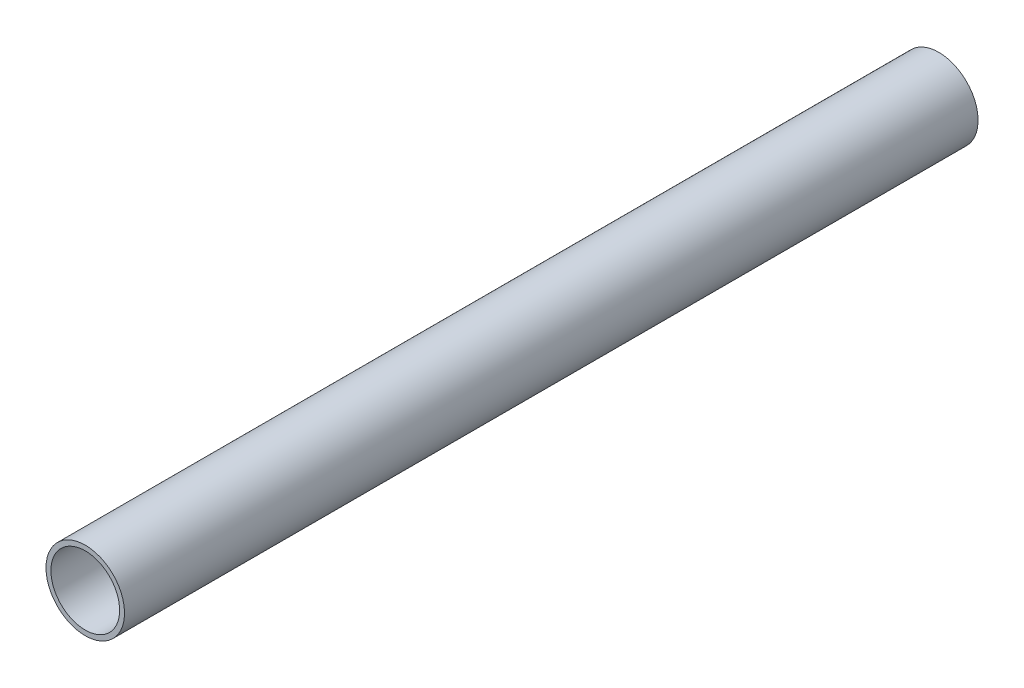
ISO-10303-21;
HEADER;
FILE_DESCRIPTION(('STEP AP214'),'2;1');
FILE_NAME('part.step','',(''),(''),'','','');
FILE_SCHEMA(('AUTOMOTIVE_DESIGN { 1 0 10303 214 1 1 1 1 }'));
ENDSEC;
DATA;
#1=APPLICATION_CONTEXT('core data for automotive mechanical design processes');
#2=APPLICATION_PROTOCOL_DEFINITION('international standard','automotive_design',2000,#1);
#3=PRODUCT_CONTEXT('',#1,'mechanical');
#4=PRODUCT('Part','Part','',(#3));
#5=PRODUCT_RELATED_PRODUCT_CATEGORY('part','',(#4));
#6=PRODUCT_DEFINITION_FORMATION('','',#4);
#7=PRODUCT_DEFINITION_CONTEXT('part definition',#1,'design');
#8=PRODUCT_DEFINITION('design','',#6,#7);
#9=PRODUCT_DEFINITION_SHAPE('','',#8);
#10=(LENGTH_UNIT() NAMED_UNIT(*) SI_UNIT(.MILLI.,.METRE.));
#11=(NAMED_UNIT(*) PLANE_ANGLE_UNIT() SI_UNIT($,.RADIAN.));
#12=(NAMED_UNIT(*) SI_UNIT($,.STERADIAN.) SOLID_ANGLE_UNIT());
#13=UNCERTAINTY_MEASURE_WITH_UNIT(LENGTH_MEASURE(1.E-05),#10,'distance_accuracy_value','');
#14=(GEOMETRIC_REPRESENTATION_CONTEXT(3) GLOBAL_UNCERTAINTY_ASSIGNED_CONTEXT((#13)) GLOBAL_UNIT_ASSIGNED_CONTEXT((#10,
#11,#12)) REPRESENTATION_CONTEXT('',''));
#15=CARTESIAN_POINT('',(0.,0.,0.));
#16=DIRECTION('',(0.,0.,1.));
#17=DIRECTION('',(1.,0.,0.));
#18=AXIS2_PLACEMENT_3D('',#15,#16,#17);
#19=CARTESIAN_POINT('',(0.,0.,280.5));
#20=DIRECTION('',(0.,0.,-1.));
#21=DIRECTION('',(-1.,0.,0.));
#22=AXIS2_PLACEMENT_3D('',#19,#20,#21);
#23=CYLINDRICAL_SURFACE('',#22,7.);
#24=CARTESIAN_POINT('',(0.,0.,23.07));
#25=DIRECTION('',(0.,0.,-1.));
#26=DIRECTION('',(-1.,0.,0.));
#27=AXIS2_PLACEMENT_3D('',#24,#25,#26);
#28=CIRCLE('',#27,7.);
#29=CARTESIAN_POINT('',(-7.,0.,23.07));
#30=VERTEX_POINT('',#29);
#31=EDGE_CURVE('E57',#30,#30,#28,.F.);
#32=ORIENTED_EDGE('',*,*,#31,.F.);
#33=EDGE_LOOP('',(#32));
#34=FACE_BOUND('',#33,.T.);
#35=CARTESIAN_POINT('',(0.,0.,197.));
#36=DIRECTION('',(0.,0.,-1.));
#37=DIRECTION('',(-1.,0.,0.));
#38=AXIS2_PLACEMENT_3D('',#35,#36,#37);
#39=CIRCLE('',#38,7.);
#40=CARTESIAN_POINT('',(-7.,0.,197.));
#41=VERTEX_POINT('',#40);
#42=EDGE_CURVE('E61',#41,#41,#39,.T.);
#43=ORIENTED_EDGE('',*,*,#42,.F.);
#44=EDGE_LOOP('',(#43));
#45=FACE_BOUND('',#44,.T.);
#46=ADVANCED_FACE('F50',(#34,#45),#23,.F.);
#47=CARTESIAN_POINT('',(0.,0.,23.07));
#48=DIRECTION('',(0.,0.,-1.));
#49=DIRECTION('',(-1.,0.,0.));
#50=AXIS2_PLACEMENT_3D('',#47,#48,#49);
#51=PLANE('',#50);
#52=ORIENTED_EDGE('',*,*,#31,.T.);
#53=EDGE_LOOP('',(#52));
#54=FACE_BOUND('',#53,.T.);
#55=CARTESIAN_POINT('',(0.,0.,23.07));
#56=DIRECTION('',(0.,0.,-1.));
#57=DIRECTION('',(-1.,0.,0.));
#58=AXIS2_PLACEMENT_3D('',#55,#56,#57);
#59=CIRCLE('',#58,8.);
#60=CARTESIAN_POINT('',(-8.,0.,23.07));
#61=VERTEX_POINT('',#60);
#62=EDGE_CURVE('E12',#61,#61,#59,.F.);
#63=ORIENTED_EDGE('',*,*,#62,.F.);
#64=EDGE_LOOP('',(#63));
#65=FACE_BOUND('',#64,.T.);
#66=ADVANCED_FACE('F52',(#54,#65),#51,.T.);
#67=CARTESIAN_POINT('',(0.,0.,280.5));
#68=DIRECTION('',(0.,0.,-1.));
#69=DIRECTION('',(-1.,0.,0.));
#70=AXIS2_PLACEMENT_3D('',#67,#68,#69);
#71=CYLINDRICAL_SURFACE('',#70,8.);
#72=ORIENTED_EDGE('',*,*,#62,.T.);
#73=EDGE_LOOP('',(#72));
#74=FACE_BOUND('',#73,.T.);
#75=CARTESIAN_POINT('',(0.,0.,197.));
#76=DIRECTION('',(0.,0.,-1.));
#77=DIRECTION('',(-1.,0.,0.));
#78=AXIS2_PLACEMENT_3D('',#75,#76,#77);
#79=CIRCLE('',#78,8.);
#80=CARTESIAN_POINT('',(-8.,0.,197.));
#81=VERTEX_POINT('',#80);
#82=EDGE_CURVE('E65',#81,#81,#79,.T.);
#83=ORIENTED_EDGE('',*,*,#82,.T.);
#84=EDGE_LOOP('',(#83));
#85=FACE_BOUND('',#84,.T.);
#86=ADVANCED_FACE('F71',(#74,#85),#71,.T.);
#87=CARTESIAN_POINT('',(-8.096,-8.096,197.));
#88=DIRECTION('',(0.,0.,1.));
#89=DIRECTION('',(1.,0.,0.));
#90=AXIS2_PLACEMENT_3D('',#87,#88,#89);
#91=PLANE('',#90);
#92=ORIENTED_EDGE('',*,*,#82,.F.);
#93=EDGE_LOOP('',(#92));
#94=FACE_BOUND('',#93,.T.);
#95=ORIENTED_EDGE('',*,*,#42,.T.);
#96=EDGE_LOOP('',(#95));
#97=FACE_BOUND('',#96,.T.);
#98=ADVANCED_FACE('F73',(#94,#97),#91,.T.);
#99=CLOSED_SHELL('',(#46,#66,#86,#98));
#100=MANIFOLD_SOLID_BREP('B2',#99);
#101=ADVANCED_BREP_SHAPE_REPRESENTATION('',(#18,#100),#14);
#102=SHAPE_DEFINITION_REPRESENTATION(#9,#101);
ENDSEC;
END-ISO-10303-21;
